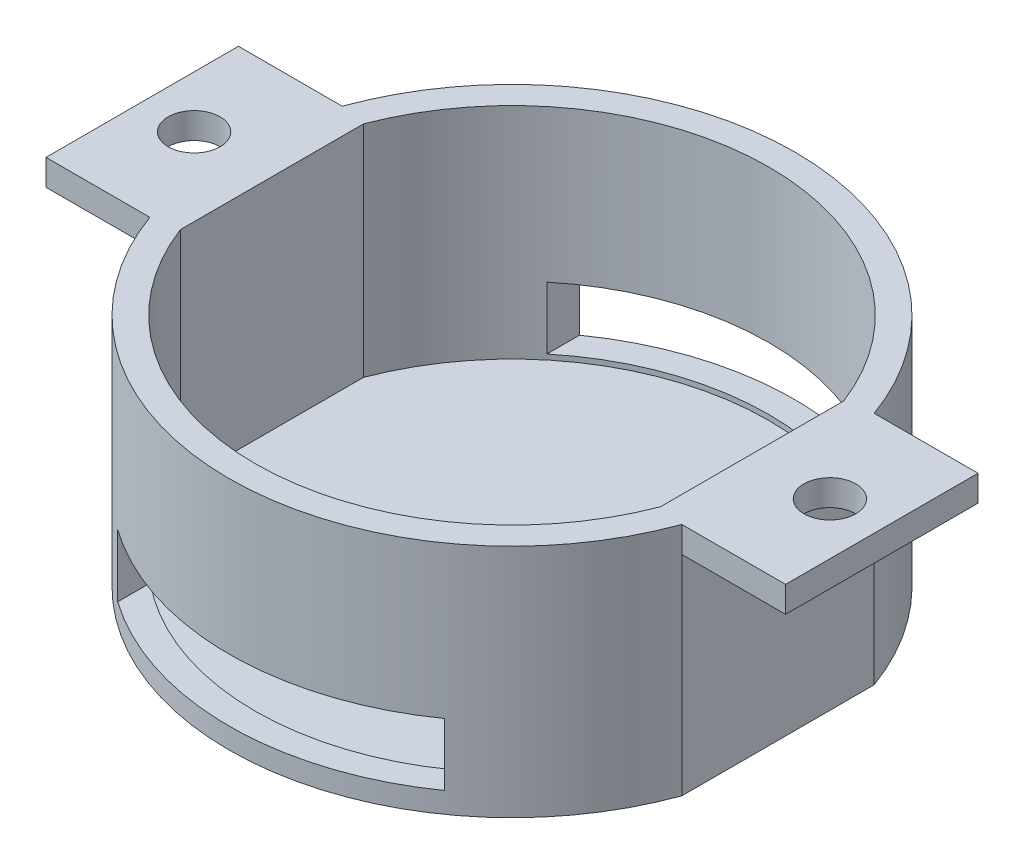
ISO-10303-21;
HEADER;
FILE_DESCRIPTION(('STEP AP214'),'2;1');
FILE_NAME('part.step','',(''),(''),'','','');
FILE_SCHEMA(('AUTOMOTIVE_DESIGN { 1 0 10303 214 1 1 1 1 }'));
ENDSEC;
DATA;
#1=APPLICATION_CONTEXT('core data for automotive mechanical design processes');
#2=APPLICATION_PROTOCOL_DEFINITION('international standard','automotive_design',2000,#1);
#3=PRODUCT_CONTEXT('',#1,'mechanical');
#4=PRODUCT('Part','Part','',(#3));
#5=PRODUCT_RELATED_PRODUCT_CATEGORY('part','',(#4));
#6=PRODUCT_DEFINITION_FORMATION('','',#4);
#7=PRODUCT_DEFINITION_CONTEXT('part definition',#1,'design');
#8=PRODUCT_DEFINITION('design','',#6,#7);
#9=PRODUCT_DEFINITION_SHAPE('','',#8);
#10=(LENGTH_UNIT() NAMED_UNIT(*) SI_UNIT(.MILLI.,.METRE.));
#11=(NAMED_UNIT(*) PLANE_ANGLE_UNIT() SI_UNIT($,.RADIAN.));
#12=(NAMED_UNIT(*) SI_UNIT($,.STERADIAN.) SOLID_ANGLE_UNIT());
#13=UNCERTAINTY_MEASURE_WITH_UNIT(LENGTH_MEASURE(1.E-05),#10,'distance_accuracy_value','');
#14=(GEOMETRIC_REPRESENTATION_CONTEXT(3) GLOBAL_UNCERTAINTY_ASSIGNED_CONTEXT((#13)) GLOBAL_UNIT_ASSIGNED_CONTEXT((#10,
#11,#12)) REPRESENTATION_CONTEXT('',''));
#15=CARTESIAN_POINT('',(0.,0.,0.));
#16=DIRECTION('',(0.,0.,1.));
#17=DIRECTION('',(1.,0.,0.));
#18=AXIS2_PLACEMENT_3D('',#15,#16,#17);
#19=CARTESIAN_POINT('',(51.25,42.3,-18.5388106414624));
#20=DIRECTION('',(-1.,0.,0.));
#21=DIRECTION('',(0.,0.,1.));
#22=AXIS2_PLACEMENT_3D('',#19,#20,#21);
#23=PLANE('',#22);
#24=DIRECTION('',(0.,0.,-1.));
#25=VECTOR('',#24,1.);
#26=CARTESIAN_POINT('',(51.25,37.3,18.5388106414624));
#27=LINE('',#26,#25);
#28=CARTESIAN_POINT('',(51.25,37.3,18.5388106414624));
#29=VERTEX_POINT('',#28);
#30=CARTESIAN_POINT('',(51.25,37.3,-18.5388106414624));
#31=VERTEX_POINT('',#30);
#32=EDGE_CURVE('E309',#29,#31,#27,.T.);
#33=ORIENTED_EDGE('',*,*,#32,.F.);
#34=DIRECTION('',(0.,-1.,0.));
#35=VECTOR('',#34,1.);
#36=CARTESIAN_POINT('',(51.25,42.3,18.5388106414624));
#37=LINE('',#36,#35);
#38=CARTESIAN_POINT('',(51.25,-3.,18.5388106414625));
#39=VERTEX_POINT('',#38);
#40=EDGE_CURVE('E224',#29,#39,#37,.T.);
#41=ORIENTED_EDGE('',*,*,#40,.T.);
#42=DIRECTION('',(0.,0.,1.));
#43=VECTOR('',#42,1.);
#44=CARTESIAN_POINT('',(51.25,-3.,0.));
#45=LINE('',#44,#43);
#46=CARTESIAN_POINT('',(51.25,-3.,-18.5388106414624));
#47=VERTEX_POINT('',#46);
#48=EDGE_CURVE('E269',#47,#39,#45,.T.);
#49=ORIENTED_EDGE('',*,*,#48,.F.);
#50=DIRECTION('',(0.,-1.,0.));
#51=VECTOR('',#50,1.);
#52=CARTESIAN_POINT('',(51.25,42.3,-18.5388106414624));
#53=LINE('',#52,#51);
#54=EDGE_CURVE('E227',#31,#47,#53,.T.);
#55=ORIENTED_EDGE('',*,*,#54,.F.);
#56=EDGE_LOOP('',(#33,#41,#49,#55));
#57=FACE_BOUND('',#56,.T.);
#58=ADVANCED_FACE('F43',(#57),#23,.F.);
#59=CARTESIAN_POINT('',(-51.25,42.3,-18.5388106414624));
#60=DIRECTION('',(1.,0.,0.));
#61=DIRECTION('',(0.,0.,-1.));
#62=AXIS2_PLACEMENT_3D('',#59,#60,#61);
#63=PLANE('',#62);
#64=DIRECTION('',(0.,0.,1.));
#65=VECTOR('',#64,1.);
#66=CARTESIAN_POINT('',(-51.25,37.3,-18.5388106414624));
#67=LINE('',#66,#65);
#68=CARTESIAN_POINT('',(-51.25,37.3,-18.5388106414624));
#69=VERTEX_POINT('',#68);
#70=CARTESIAN_POINT('',(-51.25,37.3,18.5388106414624));
#71=VERTEX_POINT('',#70);
#72=EDGE_CURVE('E285',#69,#71,#67,.T.);
#73=ORIENTED_EDGE('',*,*,#72,.F.);
#74=DIRECTION('',(0.,-1.,0.));
#75=VECTOR('',#74,1.);
#76=CARTESIAN_POINT('',(-51.25,42.3,-18.5388106414624));
#77=LINE('',#76,#75);
#78=CARTESIAN_POINT('',(-51.25,-3.,-18.5388106414625));
#79=VERTEX_POINT('',#78);
#80=EDGE_CURVE('E217',#69,#79,#77,.T.);
#81=ORIENTED_EDGE('',*,*,#80,.T.);
#82=DIRECTION('',(0.,0.,1.));
#83=VECTOR('',#82,1.);
#84=CARTESIAN_POINT('',(-51.25,-3.,0.));
#85=LINE('',#84,#83);
#86=CARTESIAN_POINT('',(-51.25,-3.,18.5388106414624));
#87=VERTEX_POINT('',#86);
#88=EDGE_CURVE('E263',#79,#87,#85,.T.);
#89=ORIENTED_EDGE('',*,*,#88,.T.);
#90=DIRECTION('',(0.,-1.,0.));
#91=VECTOR('',#90,1.);
#92=CARTESIAN_POINT('',(-51.25,42.3,18.5388106414624));
#93=LINE('',#92,#91);
#94=EDGE_CURVE('E220',#71,#87,#93,.T.);
#95=ORIENTED_EDGE('',*,*,#94,.F.);
#96=EDGE_LOOP('',(#73,#81,#89,#95));
#97=FACE_BOUND('',#96,.T.);
#98=ADVANCED_FACE('F393',(#97),#63,.F.);
#99=CARTESIAN_POINT('',(0.,42.3,0.));
#100=DIRECTION('',(0.,1.,0.));
#101=DIRECTION('',(0.,0.,1.));
#102=AXIS2_PLACEMENT_3D('',#99,#100,#101);
#103=PLANE('',#102);
#104=CARTESIAN_POINT('',(61.25,42.3,0.));
#105=DIRECTION('',(0.,1.,0.));
#106=DIRECTION('',(0.,0.,1.));
#107=AXIS2_PLACEMENT_3D('',#104,#105,#106);
#108=CIRCLE('',#107,5.);
#109=CARTESIAN_POINT('',(61.25,42.3,5.));
#110=VERTEX_POINT('',#109);
#111=EDGE_CURVE('E329',#110,#110,#108,.T.);
#112=ORIENTED_EDGE('',*,*,#111,.F.);
#113=EDGE_LOOP('',(#112));
#114=FACE_BOUND('',#113,.T.);
#115=CARTESIAN_POINT('',(-61.25,42.3,0.));
#116=DIRECTION('',(0.,1.,0.));
#117=DIRECTION('',(0.,0.,1.));
#118=AXIS2_PLACEMENT_3D('',#115,#116,#117);
#119=CIRCLE('',#118,5.);
#120=CARTESIAN_POINT('',(-61.25,42.3,5.));
#121=VERTEX_POINT('',#120);
#122=EDGE_CURVE('E323',#121,#121,#119,.T.);
#123=ORIENTED_EDGE('',*,*,#122,.F.);
#124=EDGE_LOOP('',(#123));
#125=FACE_BOUND('',#124,.T.);
#126=CARTESIAN_POINT('',(0.,42.3,0.));
#127=DIRECTION('',(0.,1.,0.));
#128=DIRECTION('',(0.,0.,1.));
#129=AXIS2_PLACEMENT_3D('',#126,#127,#128);
#130=CIRCLE('',#129,54.5);
#131=CARTESIAN_POINT('',(51.25,42.3,-18.5388106414624));
#132=VERTEX_POINT('',#131);
#133=CARTESIAN_POINT('',(-51.25,42.3,-18.5388106414624));
#134=VERTEX_POINT('',#133);
#135=EDGE_CURVE('E230',#132,#134,#130,.T.);
#136=ORIENTED_EDGE('',*,*,#135,.T.);
#137=DIRECTION('',(1.,0.,0.));
#138=VECTOR('',#137,1.);
#139=CARTESIAN_POINT('',(-71.25,42.3,-18.5388106414624));
#140=LINE('',#139,#138);
#141=CARTESIAN_POINT('',(-71.25,42.3,-18.5388106414624));
#142=VERTEX_POINT('',#141);
#143=EDGE_CURVE('E281',#142,#134,#140,.T.);
#144=ORIENTED_EDGE('',*,*,#143,.F.);
#145=DIRECTION('',(0.,0.,-1.));
#146=VECTOR('',#145,1.);
#147=CARTESIAN_POINT('',(-71.25,42.3,-18.5388106414624));
#148=LINE('',#147,#146);
#149=CARTESIAN_POINT('',(-71.25,42.3,18.5388106414624));
#150=VERTEX_POINT('',#149);
#151=EDGE_CURVE('E284',#150,#142,#148,.T.);
#152=ORIENTED_EDGE('',*,*,#151,.F.);
#153=DIRECTION('',(1.,0.,0.));
#154=VECTOR('',#153,1.);
#155=CARTESIAN_POINT('',(-71.25,42.3,18.5388106414624));
#156=LINE('',#155,#154);
#157=CARTESIAN_POINT('',(-51.25,42.3,18.5388106414624));
#158=VERTEX_POINT('',#157);
#159=EDGE_CURVE('E278',#150,#158,#156,.T.);
#160=ORIENTED_EDGE('',*,*,#159,.T.);
#161=CARTESIAN_POINT('',(0.,42.3,0.));
#162=DIRECTION('',(0.,1.,0.));
#163=DIRECTION('',(0.,0.,1.));
#164=AXIS2_PLACEMENT_3D('',#161,#162,#163);
#165=CIRCLE('',#164,54.5);
#166=CARTESIAN_POINT('',(51.25,42.3,18.5388106414624));
#167=VERTEX_POINT('',#166);
#168=EDGE_CURVE('E228',#158,#167,#165,.T.);
#169=ORIENTED_EDGE('',*,*,#168,.T.);
#170=DIRECTION('',(-1.,0.,0.));
#171=VECTOR('',#170,1.);
#172=CARTESIAN_POINT('',(71.25,42.3,18.5388106414624));
#173=LINE('',#172,#171);
#174=CARTESIAN_POINT('',(71.25,42.3,18.5388106414624));
#175=VERTEX_POINT('',#174);
#176=EDGE_CURVE('E305',#175,#167,#173,.T.);
#177=ORIENTED_EDGE('',*,*,#176,.F.);
#178=DIRECTION('',(0.,0.,1.));
#179=VECTOR('',#178,1.);
#180=CARTESIAN_POINT('',(71.25,42.3,18.5388106414624));
#181=LINE('',#180,#179);
#182=CARTESIAN_POINT('',(71.25,42.3,-18.5388106414624));
#183=VERTEX_POINT('',#182);
#184=EDGE_CURVE('E308',#183,#175,#181,.T.);
#185=ORIENTED_EDGE('',*,*,#184,.F.);
#186=DIRECTION('',(-1.,0.,0.));
#187=VECTOR('',#186,1.);
#188=CARTESIAN_POINT('',(71.25,42.3,-18.5388106414624));
#189=LINE('',#188,#187);
#190=EDGE_CURVE('E302',#183,#132,#189,.T.);
#191=ORIENTED_EDGE('',*,*,#190,.T.);
#192=EDGE_LOOP('',(#136,#144,#152,#160,#169,#177,#185,#191));
#193=FACE_BOUND('',#192,.T.);
#194=DIRECTION('',(0.,0.,1.));
#195=VECTOR('',#194,1.);
#196=CARTESIAN_POINT('',(-46.25,42.3,-17.6405073623181));
#197=LINE('',#196,#195);
#198=CARTESIAN_POINT('',(-46.25,42.3,-17.6405073623181));
#199=VERTEX_POINT('',#198);
#200=CARTESIAN_POINT('',(-46.25,42.3,17.6405073623181));
#201=VERTEX_POINT('',#200);
#202=EDGE_CURVE('E260',#199,#201,#197,.T.);
#203=ORIENTED_EDGE('',*,*,#202,.F.);
#204=CARTESIAN_POINT('',(0.,42.3,0.));
#205=DIRECTION('',(0.,1.,0.));
#206=DIRECTION('',(0.,0.,1.));
#207=AXIS2_PLACEMENT_3D('',#204,#205,#206);
#208=CIRCLE('',#207,49.5);
#209=CARTESIAN_POINT('',(46.25,42.3,-17.6405073623181));
#210=VERTEX_POINT('',#209);
#211=EDGE_CURVE('E245',#210,#199,#208,.T.);
#212=ORIENTED_EDGE('',*,*,#211,.F.);
#213=DIRECTION('',(0.,0.,-1.));
#214=VECTOR('',#213,1.);
#215=CARTESIAN_POINT('',(46.25,42.3,-17.6405073623181));
#216=LINE('',#215,#214);
#217=CARTESIAN_POINT('',(46.25,42.3,17.6405073623182));
#218=VERTEX_POINT('',#217);
#219=EDGE_CURVE('E241',#218,#210,#216,.T.);
#220=ORIENTED_EDGE('',*,*,#219,.F.);
#221=CARTESIAN_POINT('',(0.,42.3,0.));
#222=DIRECTION('',(0.,1.,0.));
#223=DIRECTION('',(0.,0.,1.));
#224=AXIS2_PLACEMENT_3D('',#221,#222,#223);
#225=CIRCLE('',#224,49.5);
#226=EDGE_CURVE('E257',#201,#218,#225,.T.);
#227=ORIENTED_EDGE('',*,*,#226,.F.);
#228=EDGE_LOOP('',(#203,#212,#220,#227));
#229=FACE_BOUND('',#228,.T.);
#230=ADVANCED_FACE('F399',(#114,#125,#193,#229),#103,.T.);
#231=CARTESIAN_POINT('',(0.,42.3,0.));
#232=DIRECTION('',(0.,-1.,0.));
#233=DIRECTION('',(0.,0.,-1.));
#234=AXIS2_PLACEMENT_3D('',#231,#232,#233);
#235=CYLINDRICAL_SURFACE('',#234,54.5);
#236=DIRECTION('',(0.,-1.,0.));
#237=VECTOR('',#236,1.);
#238=CARTESIAN_POINT('',(-31.477498370648,42.3,-44.4906405474888));
#239=LINE('',#238,#237);
#240=CARTESIAN_POINT('',(-31.477498370648,13.,-44.4906405474888));
#241=VERTEX_POINT('',#240);
#242=CARTESIAN_POINT('',(-31.477498370648,1.,-44.4906405474888));
#243=VERTEX_POINT('',#242);
#244=EDGE_CURVE('E354',#241,#243,#239,.T.);
#245=ORIENTED_EDGE('',*,*,#244,.T.);
#246=CARTESIAN_POINT('',(0.,0.999999999999994,0.));
#247=DIRECTION('',(0.,-1.,0.));
#248=DIRECTION('',(1.,0.,0.));
#249=AXIS2_PLACEMENT_3D('',#246,#247,#248);
#250=CIRCLE('',#249,54.5);
#251=CARTESIAN_POINT('',(31.477498370648,0.999999999999992,-44.4906405474888));
#252=VERTEX_POINT('',#251);
#253=EDGE_CURVE('E332',#243,#252,#250,.T.);
#254=ORIENTED_EDGE('',*,*,#253,.T.);
#255=DIRECTION('',(0.,-1.,0.));
#256=VECTOR('',#255,1.);
#257=CARTESIAN_POINT('',(31.477498370648,42.3,-44.4906405474888));
#258=LINE('',#257,#256);
#259=CARTESIAN_POINT('',(31.477498370648,13.,-44.4906405474888));
#260=VERTEX_POINT('',#259);
#261=EDGE_CURVE('E339',#252,#260,#258,.F.);
#262=ORIENTED_EDGE('',*,*,#261,.T.);
#263=CARTESIAN_POINT('',(0.,13.,0.));
#264=DIRECTION('',(0.,1.,0.));
#265=DIRECTION('',(-1.,0.,0.));
#266=AXIS2_PLACEMENT_3D('',#263,#264,#265);
#267=CIRCLE('',#266,54.5);
#268=EDGE_CURVE('E347',#260,#241,#267,.T.);
#269=ORIENTED_EDGE('',*,*,#268,.T.);
#270=EDGE_LOOP('',(#245,#254,#262,#269));
#271=FACE_BOUND('',#270,.T.);
#272=EDGE_CURVE('E225',#132,#31,#53,.T.);
#273=ORIENTED_EDGE('',*,*,#272,.T.);
#274=ORIENTED_EDGE('',*,*,#54,.T.);
#275=CARTESIAN_POINT('',(0.,-3.,0.));
#276=DIRECTION('',(0.,-1.,0.));
#277=DIRECTION('',(0.,0.,-1.));
#278=AXIS2_PLACEMENT_3D('',#275,#276,#277);
#279=CIRCLE('',#278,54.5);
#280=EDGE_CURVE('E255',#79,#47,#279,.T.);
#281=ORIENTED_EDGE('',*,*,#280,.F.);
#282=ORIENTED_EDGE('',*,*,#80,.F.);
#283=EDGE_CURVE('E199',#134,#69,#77,.T.);
#284=ORIENTED_EDGE('',*,*,#283,.F.);
#285=ORIENTED_EDGE('',*,*,#135,.F.);
#286=EDGE_LOOP('',(#273,#274,#281,#282,#284,#285));
#287=FACE_BOUND('',#286,.T.);
#288=ADVANCED_FACE('F45',(#271,#287),#235,.T.);
#289=CARTESIAN_POINT('',(0.,42.3,0.));
#290=DIRECTION('',(0.,-1.,0.));
#291=DIRECTION('',(0.,0.,-1.));
#292=AXIS2_PLACEMENT_3D('',#289,#290,#291);
#293=CYLINDRICAL_SURFACE('',#292,54.5);
#294=DIRECTION('',(0.,-1.,0.));
#295=VECTOR('',#294,1.);
#296=CARTESIAN_POINT('',(-31.477498370648,42.3,44.4906405474888));
#297=LINE('',#296,#295);
#298=CARTESIAN_POINT('',(-31.477498370648,1.,44.4906405474888));
#299=VERTEX_POINT('',#298);
#300=CARTESIAN_POINT('',(-31.477498370648,13.,44.4906405474888));
#301=VERTEX_POINT('',#300);
#302=EDGE_CURVE('E357',#299,#301,#297,.F.);
#303=ORIENTED_EDGE('',*,*,#302,.T.);
#304=CARTESIAN_POINT('',(0.,13.,0.));
#305=DIRECTION('',(0.,1.,0.));
#306=DIRECTION('',(-1.,0.,0.));
#307=AXIS2_PLACEMENT_3D('',#304,#305,#306);
#308=CIRCLE('',#307,54.5);
#309=CARTESIAN_POINT('',(31.477498370648,13.,44.4906405474888));
#310=VERTEX_POINT('',#309);
#311=EDGE_CURVE('E205',#301,#310,#308,.T.);
#312=ORIENTED_EDGE('',*,*,#311,.T.);
#313=DIRECTION('',(0.,-1.,0.));
#314=VECTOR('',#313,1.);
#315=CARTESIAN_POINT('',(31.477498370648,42.3,44.4906405474888));
#316=LINE('',#315,#314);
#317=CARTESIAN_POINT('',(31.477498370648,0.999999999999992,44.4906405474888));
#318=VERTEX_POINT('',#317);
#319=EDGE_CURVE('E342',#310,#318,#316,.T.);
#320=ORIENTED_EDGE('',*,*,#319,.T.);
#321=CARTESIAN_POINT('',(0.,0.999999999999994,0.));
#322=DIRECTION('',(0.,-1.,0.));
#323=DIRECTION('',(1.,0.,0.));
#324=AXIS2_PLACEMENT_3D('',#321,#322,#323);
#325=CIRCLE('',#324,54.5);
#326=EDGE_CURVE('E335',#318,#299,#325,.T.);
#327=ORIENTED_EDGE('',*,*,#326,.T.);
#328=EDGE_LOOP('',(#303,#312,#320,#327));
#329=FACE_BOUND('',#328,.T.);
#330=EDGE_CURVE('E218',#158,#71,#93,.T.);
#331=ORIENTED_EDGE('',*,*,#330,.T.);
#332=ORIENTED_EDGE('',*,*,#94,.T.);
#333=EDGE_CURVE('E266',#39,#87,#279,.T.);
#334=ORIENTED_EDGE('',*,*,#333,.F.);
#335=ORIENTED_EDGE('',*,*,#40,.F.);
#336=EDGE_CURVE('E221',#167,#29,#37,.T.);
#337=ORIENTED_EDGE('',*,*,#336,.F.);
#338=ORIENTED_EDGE('',*,*,#168,.F.);
#339=EDGE_LOOP('',(#331,#332,#334,#335,#337,#338));
#340=FACE_BOUND('',#339,.T.);
#341=ADVANCED_FACE('F377',(#329,#340),#293,.T.);
#342=CARTESIAN_POINT('',(0.,42.3,0.));
#343=DIRECTION('',(0.,-1.,0.));
#344=DIRECTION('',(0.,0.,-1.));
#345=AXIS2_PLACEMENT_3D('',#342,#343,#344);
#346=CYLINDRICAL_SURFACE('',#345,49.5);
#347=CARTESIAN_POINT('',(0.,0.999999999999994,0.));
#348=DIRECTION('',(0.,-1.,0.));
#349=DIRECTION('',(1.,0.,0.));
#350=AXIS2_PLACEMENT_3D('',#347,#348,#349);
#351=CIRCLE('',#350,49.5);
#352=CARTESIAN_POINT('',(-31.477498370648,1.,-38.2023179444109));
#353=VERTEX_POINT('',#352);
#354=CARTESIAN_POINT('',(31.477498370648,0.999999999999992,-38.2023179444109));
#355=VERTEX_POINT('',#354);
#356=EDGE_CURVE('E337',#353,#355,#351,.T.);
#357=ORIENTED_EDGE('',*,*,#356,.F.);
#358=DIRECTION('',(0.,-1.,0.));
#359=VECTOR('',#358,1.);
#360=CARTESIAN_POINT('',(-31.477498370648,42.3,-38.2023179444109));
#361=LINE('',#360,#359);
#362=CARTESIAN_POINT('',(-31.477498370648,13.,-38.2023179444109));
#363=VERTEX_POINT('',#362);
#364=EDGE_CURVE('E359',#363,#353,#361,.T.);
#365=ORIENTED_EDGE('',*,*,#364,.F.);
#366=CARTESIAN_POINT('',(0.,13.,0.));
#367=DIRECTION('',(0.,1.,0.));
#368=DIRECTION('',(-1.,0.,0.));
#369=AXIS2_PLACEMENT_3D('',#366,#367,#368);
#370=CIRCLE('',#369,49.5);
#371=CARTESIAN_POINT('',(31.477498370648,13.,-38.2023179444109));
#372=VERTEX_POINT('',#371);
#373=EDGE_CURVE('E351',#372,#363,#370,.T.);
#374=ORIENTED_EDGE('',*,*,#373,.F.);
#375=DIRECTION('',(0.,-1.,0.));
#376=VECTOR('',#375,1.);
#377=CARTESIAN_POINT('',(31.477498370648,42.3,-38.2023179444109));
#378=LINE('',#377,#376);
#379=EDGE_CURVE('E345',#355,#372,#378,.F.);
#380=ORIENTED_EDGE('',*,*,#379,.F.);
#381=EDGE_LOOP('',(#357,#365,#374,#380));
#382=FACE_BOUND('',#381,.T.);
#383=CARTESIAN_POINT('',(0.,0.,0.));
#384=DIRECTION('',(0.,1.,0.));
#385=DIRECTION('',(0.,0.,1.));
#386=AXIS2_PLACEMENT_3D('',#383,#384,#385);
#387=CIRCLE('',#386,49.5);
#388=CARTESIAN_POINT('',(46.25,0.,-17.6405073623181));
#389=VERTEX_POINT('',#388);
#390=CARTESIAN_POINT('',(-46.25,0.,-17.6405073623181));
#391=VERTEX_POINT('',#390);
#392=EDGE_CURVE('E252',#389,#391,#387,.T.);
#393=ORIENTED_EDGE('',*,*,#392,.F.);
#394=DIRECTION('',(0.,-1.,0.));
#395=VECTOR('',#394,1.);
#396=CARTESIAN_POINT('',(46.25,42.3,-17.6405073623181));
#397=LINE('',#396,#395);
#398=EDGE_CURVE('E239',#210,#389,#397,.T.);
#399=ORIENTED_EDGE('',*,*,#398,.F.);
#400=ORIENTED_EDGE('',*,*,#211,.T.);
#401=DIRECTION('',(0.,-1.,0.));
#402=VECTOR('',#401,1.);
#403=CARTESIAN_POINT('',(-46.25,42.3,-17.6405073623181));
#404=LINE('',#403,#402);
#405=EDGE_CURVE('E232',#199,#391,#404,.T.);
#406=ORIENTED_EDGE('',*,*,#405,.T.);
#407=EDGE_LOOP('',(#393,#399,#400,#406));
#408=FACE_BOUND('',#407,.T.);
#409=ADVANCED_FACE('F405',(#382,#408),#346,.F.);
#410=CARTESIAN_POINT('',(-46.25,42.3,-17.6405073623181));
#411=DIRECTION('',(1.,0.,0.));
#412=DIRECTION('',(0.,0.,-1.));
#413=AXIS2_PLACEMENT_3D('',#410,#411,#412);
#414=PLANE('',#413);
#415=DIRECTION('',(0.,0.,1.));
#416=VECTOR('',#415,1.);
#417=CARTESIAN_POINT('',(-46.25,0.,-17.6405073623181));
#418=LINE('',#417,#416);
#419=CARTESIAN_POINT('',(-46.25,0.,17.6405073623181));
#420=VERTEX_POINT('',#419);
#421=EDGE_CURVE('E249',#391,#420,#418,.T.);
#422=ORIENTED_EDGE('',*,*,#421,.F.);
#423=ORIENTED_EDGE('',*,*,#405,.F.);
#424=ORIENTED_EDGE('',*,*,#202,.T.);
#425=DIRECTION('',(0.,-1.,0.));
#426=VECTOR('',#425,1.);
#427=CARTESIAN_POINT('',(-46.25,42.3,17.6405073623181));
#428=LINE('',#427,#426);
#429=EDGE_CURVE('E235',#201,#420,#428,.T.);
#430=ORIENTED_EDGE('',*,*,#429,.T.);
#431=EDGE_LOOP('',(#422,#423,#424,#430));
#432=FACE_BOUND('',#431,.T.);
#433=ADVANCED_FACE('F410',(#432),#414,.T.);
#434=CARTESIAN_POINT('',(0.,42.3,0.));
#435=DIRECTION('',(0.,-1.,0.));
#436=DIRECTION('',(0.,0.,-1.));
#437=AXIS2_PLACEMENT_3D('',#434,#435,#436);
#438=CYLINDRICAL_SURFACE('',#437,49.5);
#439=CARTESIAN_POINT('',(0.,0.999999999999994,0.));
#440=DIRECTION('',(0.,-1.,0.));
#441=DIRECTION('',(1.,0.,0.));
#442=AXIS2_PLACEMENT_3D('',#439,#440,#441);
#443=CIRCLE('',#442,49.5);
#444=CARTESIAN_POINT('',(31.477498370648,0.999999999999992,38.2023179444109));
#445=VERTEX_POINT('',#444);
#446=CARTESIAN_POINT('',(-31.477498370648,1.,38.2023179444109));
#447=VERTEX_POINT('',#446);
#448=EDGE_CURVE('E11',#445,#447,#443,.T.);
#449=ORIENTED_EDGE('',*,*,#448,.F.);
#450=DIRECTION('',(0.,-1.,0.));
#451=VECTOR('',#450,1.);
#452=CARTESIAN_POINT('',(31.477498370648,42.3,38.2023179444109));
#453=LINE('',#452,#451);
#454=CARTESIAN_POINT('',(31.477498370648,13.,38.2023179444109));
#455=VERTEX_POINT('',#454);
#456=EDGE_CURVE('E51',#455,#445,#453,.T.);
#457=ORIENTED_EDGE('',*,*,#456,.F.);
#458=CARTESIAN_POINT('',(0.,13.,0.));
#459=DIRECTION('',(0.,1.,0.));
#460=DIRECTION('',(-1.,0.,0.));
#461=AXIS2_PLACEMENT_3D('',#458,#459,#460);
#462=CIRCLE('',#461,49.5);
#463=CARTESIAN_POINT('',(-31.477498370648,13.,38.2023179444109));
#464=VERTEX_POINT('',#463);
#465=EDGE_CURVE('E198',#464,#455,#462,.T.);
#466=ORIENTED_EDGE('',*,*,#465,.F.);
#467=DIRECTION('',(0.,-1.,0.));
#468=VECTOR('',#467,1.);
#469=CARTESIAN_POINT('',(-31.477498370648,42.3,38.2023179444109));
#470=LINE('',#469,#468);
#471=EDGE_CURVE('E191',#447,#464,#470,.F.);
#472=ORIENTED_EDGE('',*,*,#471,.F.);
#473=EDGE_LOOP('',(#449,#457,#466,#472));
#474=FACE_BOUND('',#473,.T.);
#475=CARTESIAN_POINT('',(0.,0.,0.));
#476=DIRECTION('',(0.,1.,0.));
#477=DIRECTION('',(0.,0.,1.));
#478=AXIS2_PLACEMENT_3D('',#475,#476,#477);
#479=CIRCLE('',#478,49.5);
#480=CARTESIAN_POINT('',(46.25,0.,17.6405073623182));
#481=VERTEX_POINT('',#480);
#482=EDGE_CURVE('E246',#420,#481,#479,.T.);
#483=ORIENTED_EDGE('',*,*,#482,.F.);
#484=ORIENTED_EDGE('',*,*,#429,.F.);
#485=ORIENTED_EDGE('',*,*,#226,.T.);
#486=DIRECTION('',(0.,-1.,0.));
#487=VECTOR('',#486,1.);
#488=CARTESIAN_POINT('',(46.25,42.3,17.6405073623182));
#489=LINE('',#488,#487);
#490=EDGE_CURVE('E237',#218,#481,#489,.T.);
#491=ORIENTED_EDGE('',*,*,#490,.T.);
#492=EDGE_LOOP('',(#483,#484,#485,#491));
#493=FACE_BOUND('',#492,.T.);
#494=ADVANCED_FACE('F211',(#474,#493),#438,.F.);
#495=CARTESIAN_POINT('',(46.25,42.3,-17.6405073623181));
#496=DIRECTION('',(-1.,0.,0.));
#497=DIRECTION('',(0.,0.,1.));
#498=AXIS2_PLACEMENT_3D('',#495,#496,#497);
#499=PLANE('',#498);
#500=DIRECTION('',(0.,0.,-1.));
#501=VECTOR('',#500,1.);
#502=CARTESIAN_POINT('',(46.25,0.,-17.6405073623181));
#503=LINE('',#502,#501);
#504=EDGE_CURVE('E242',#481,#389,#503,.T.);
#505=ORIENTED_EDGE('',*,*,#504,.F.);
#506=ORIENTED_EDGE('',*,*,#490,.F.);
#507=ORIENTED_EDGE('',*,*,#219,.T.);
#508=ORIENTED_EDGE('',*,*,#398,.T.);
#509=EDGE_LOOP('',(#505,#506,#507,#508));
#510=FACE_BOUND('',#509,.T.);
#511=ADVANCED_FACE('F486',(#510),#499,.T.);
#512=CARTESIAN_POINT('',(0.,0.,0.));
#513=DIRECTION('',(0.,-1.,0.));
#514=DIRECTION('',(0.,0.,-1.));
#515=AXIS2_PLACEMENT_3D('',#512,#513,#514);
#516=PLANE('',#515);
#517=ORIENTED_EDGE('',*,*,#504,.T.);
#518=ORIENTED_EDGE('',*,*,#392,.T.);
#519=ORIENTED_EDGE('',*,*,#421,.T.);
#520=ORIENTED_EDGE('',*,*,#482,.T.);
#521=EDGE_LOOP('',(#517,#518,#519,#520));
#522=FACE_BOUND('',#521,.T.);
#523=ADVANCED_FACE('F483',(#522),#516,.F.);
#524=CARTESIAN_POINT('',(0.,-3.,0.));
#525=DIRECTION('',(0.,-1.,0.));
#526=DIRECTION('',(0.,0.,-1.));
#527=AXIS2_PLACEMENT_3D('',#524,#525,#526);
#528=PLANE('',#527);
#529=ORIENTED_EDGE('',*,*,#48,.T.);
#530=ORIENTED_EDGE('',*,*,#333,.T.);
#531=ORIENTED_EDGE('',*,*,#88,.F.);
#532=ORIENTED_EDGE('',*,*,#280,.T.);
#533=EDGE_LOOP('',(#529,#530,#531,#532));
#534=FACE_BOUND('',#533,.T.);
#535=ADVANCED_FACE('F447',(#534),#528,.T.);
#536=CARTESIAN_POINT('',(-71.25,42.3,-18.5388106414624));
#537=DIRECTION('',(0.,0.,1.));
#538=DIRECTION('',(1.,0.,0.));
#539=AXIS2_PLACEMENT_3D('',#536,#537,#538);
#540=PLANE('',#539);
#541=ORIENTED_EDGE('',*,*,#283,.T.);
#542=DIRECTION('',(1.,0.,0.));
#543=VECTOR('',#542,1.);
#544=CARTESIAN_POINT('',(-71.25,37.3,-18.5388106414624));
#545=LINE('',#544,#543);
#546=CARTESIAN_POINT('',(-71.25,37.3,-18.5388106414624));
#547=VERTEX_POINT('',#546);
#548=EDGE_CURVE('E272',#547,#69,#545,.T.);
#549=ORIENTED_EDGE('',*,*,#548,.F.);
#550=DIRECTION('',(0.,-1.,0.));
#551=VECTOR('',#550,1.);
#552=CARTESIAN_POINT('',(-71.25,42.3,-18.5388106414624));
#553=LINE('',#552,#551);
#554=EDGE_CURVE('E288',#142,#547,#553,.T.);
#555=ORIENTED_EDGE('',*,*,#554,.F.);
#556=ORIENTED_EDGE('',*,*,#143,.T.);
#557=EDGE_LOOP('',(#541,#549,#555,#556));
#558=FACE_BOUND('',#557,.T.);
#559=ADVANCED_FACE('F455',(#558),#540,.F.);
#560=CARTESIAN_POINT('',(-71.25,37.3,-18.5388106414624));
#561=DIRECTION('',(0.,1.,0.));
#562=DIRECTION('',(0.,0.,1.));
#563=AXIS2_PLACEMENT_3D('',#560,#561,#562);
#564=PLANE('',#563);
#565=CARTESIAN_POINT('',(-61.25,37.3,0.));
#566=DIRECTION('',(0.,1.,0.));
#567=DIRECTION('',(0.,0.,1.));
#568=AXIS2_PLACEMENT_3D('',#565,#566,#567);
#569=CIRCLE('',#568,5.);
#570=CARTESIAN_POINT('',(-61.25,37.3,5.));
#571=VERTEX_POINT('',#570);
#572=EDGE_CURVE('E313',#571,#571,#569,.F.);
#573=ORIENTED_EDGE('',*,*,#572,.F.);
#574=EDGE_LOOP('',(#573));
#575=FACE_BOUND('',#574,.T.);
#576=ORIENTED_EDGE('',*,*,#72,.T.);
#577=DIRECTION('',(1.,0.,0.));
#578=VECTOR('',#577,1.);
#579=CARTESIAN_POINT('',(-71.25,37.3,18.5388106414624));
#580=LINE('',#579,#578);
#581=CARTESIAN_POINT('',(-71.25,37.3,18.5388106414624));
#582=VERTEX_POINT('',#581);
#583=EDGE_CURVE('E275',#582,#71,#580,.T.);
#584=ORIENTED_EDGE('',*,*,#583,.F.);
#585=DIRECTION('',(0.,0.,1.));
#586=VECTOR('',#585,1.);
#587=CARTESIAN_POINT('',(-71.25,37.3,-18.5388106414624));
#588=LINE('',#587,#586);
#589=EDGE_CURVE('E293',#547,#582,#588,.T.);
#590=ORIENTED_EDGE('',*,*,#589,.F.);
#591=ORIENTED_EDGE('',*,*,#548,.T.);
#592=EDGE_LOOP('',(#576,#584,#590,#591));
#593=FACE_BOUND('',#592,.T.);
#594=ADVANCED_FACE('F451',(#575,#593),#564,.F.);
#595=CARTESIAN_POINT('',(-71.25,42.3,18.5388106414624));
#596=DIRECTION('',(0.,0.,-1.));
#597=DIRECTION('',(-1.,0.,0.));
#598=AXIS2_PLACEMENT_3D('',#595,#596,#597);
#599=PLANE('',#598);
#600=ORIENTED_EDGE('',*,*,#330,.F.);
#601=ORIENTED_EDGE('',*,*,#159,.F.);
#602=DIRECTION('',(0.,1.,0.));
#603=VECTOR('',#602,1.);
#604=CARTESIAN_POINT('',(-71.25,42.3,18.5388106414624));
#605=LINE('',#604,#603);
#606=EDGE_CURVE('E291',#582,#150,#605,.T.);
#607=ORIENTED_EDGE('',*,*,#606,.F.);
#608=ORIENTED_EDGE('',*,*,#583,.T.);
#609=EDGE_LOOP('',(#600,#601,#607,#608));
#610=FACE_BOUND('',#609,.T.);
#611=ADVANCED_FACE('F463',(#610),#599,.F.);
#612=CARTESIAN_POINT('',(-71.25,0.,0.));
#613=DIRECTION('',(-1.,0.,0.));
#614=DIRECTION('',(0.,0.,1.));
#615=AXIS2_PLACEMENT_3D('',#612,#613,#614);
#616=PLANE('',#615);
#617=ORIENTED_EDGE('',*,*,#554,.T.);
#618=ORIENTED_EDGE('',*,*,#589,.T.);
#619=ORIENTED_EDGE('',*,*,#606,.T.);
#620=ORIENTED_EDGE('',*,*,#151,.T.);
#621=EDGE_LOOP('',(#617,#618,#619,#620));
#622=FACE_BOUND('',#621,.T.);
#623=ADVANCED_FACE('F465',(#622),#616,.T.);
#624=CARTESIAN_POINT('',(71.25,42.3,18.5388106414624));
#625=DIRECTION('',(0.,0.,-1.));
#626=DIRECTION('',(-1.,0.,0.));
#627=AXIS2_PLACEMENT_3D('',#624,#625,#626);
#628=PLANE('',#627);
#629=ORIENTED_EDGE('',*,*,#336,.T.);
#630=DIRECTION('',(-1.,0.,0.));
#631=VECTOR('',#630,1.);
#632=CARTESIAN_POINT('',(71.25,37.3,18.5388106414624));
#633=LINE('',#632,#631);
#634=CARTESIAN_POINT('',(71.25,37.3,18.5388106414624));
#635=VERTEX_POINT('',#634);
#636=EDGE_CURVE('E289',#635,#29,#633,.T.);
#637=ORIENTED_EDGE('',*,*,#636,.F.);
#638=DIRECTION('',(0.,-1.,0.));
#639=VECTOR('',#638,1.);
#640=CARTESIAN_POINT('',(71.25,42.3,18.5388106414624));
#641=LINE('',#640,#639);
#642=EDGE_CURVE('E312',#175,#635,#641,.T.);
#643=ORIENTED_EDGE('',*,*,#642,.F.);
#644=ORIENTED_EDGE('',*,*,#176,.T.);
#645=EDGE_LOOP('',(#629,#637,#643,#644));
#646=FACE_BOUND('',#645,.T.);
#647=ADVANCED_FACE('F440',(#646),#628,.F.);
#648=CARTESIAN_POINT('',(71.25,37.3,18.5388106414624));
#649=DIRECTION('',(0.,1.,0.));
#650=DIRECTION('',(0.,0.,1.));
#651=AXIS2_PLACEMENT_3D('',#648,#649,#650);
#652=PLANE('',#651);
#653=CARTESIAN_POINT('',(61.25,37.3,0.));
#654=DIRECTION('',(0.,1.,0.));
#655=DIRECTION('',(0.,0.,1.));
#656=AXIS2_PLACEMENT_3D('',#653,#654,#655);
#657=CIRCLE('',#656,5.);
#658=CARTESIAN_POINT('',(61.25,37.3,5.));
#659=VERTEX_POINT('',#658);
#660=EDGE_CURVE('E326',#659,#659,#657,.F.);
#661=ORIENTED_EDGE('',*,*,#660,.F.);
#662=EDGE_LOOP('',(#661));
#663=FACE_BOUND('',#662,.T.);
#664=ORIENTED_EDGE('',*,*,#32,.T.);
#665=DIRECTION('',(-1.,0.,0.));
#666=VECTOR('',#665,1.);
#667=CARTESIAN_POINT('',(71.25,37.3,-18.5388106414624));
#668=LINE('',#667,#666);
#669=CARTESIAN_POINT('',(71.25,37.3,-18.5388106414624));
#670=VERTEX_POINT('',#669);
#671=EDGE_CURVE('E299',#670,#31,#668,.T.);
#672=ORIENTED_EDGE('',*,*,#671,.F.);
#673=DIRECTION('',(0.,0.,-1.));
#674=VECTOR('',#673,1.);
#675=CARTESIAN_POINT('',(71.25,37.3,18.5388106414624));
#676=LINE('',#675,#674);
#677=EDGE_CURVE('E317',#635,#670,#676,.T.);
#678=ORIENTED_EDGE('',*,*,#677,.F.);
#679=ORIENTED_EDGE('',*,*,#636,.T.);
#680=EDGE_LOOP('',(#664,#672,#678,#679));
#681=FACE_BOUND('',#680,.T.);
#682=ADVANCED_FACE('F430',(#663,#681),#652,.F.);
#683=CARTESIAN_POINT('',(71.25,42.3,-18.5388106414624));
#684=DIRECTION('',(0.,0.,1.));
#685=DIRECTION('',(1.,0.,0.));
#686=AXIS2_PLACEMENT_3D('',#683,#684,#685);
#687=PLANE('',#686);
#688=ORIENTED_EDGE('',*,*,#272,.F.);
#689=ORIENTED_EDGE('',*,*,#190,.F.);
#690=DIRECTION('',(0.,1.,0.));
#691=VECTOR('',#690,1.);
#692=CARTESIAN_POINT('',(71.25,42.3,-18.5388106414624));
#693=LINE('',#692,#691);
#694=EDGE_CURVE('E315',#670,#183,#693,.T.);
#695=ORIENTED_EDGE('',*,*,#694,.F.);
#696=ORIENTED_EDGE('',*,*,#671,.T.);
#697=EDGE_LOOP('',(#688,#689,#695,#696));
#698=FACE_BOUND('',#697,.T.);
#699=ADVANCED_FACE('F433',(#698),#687,.F.);
#700=CARTESIAN_POINT('',(71.25,0.,0.));
#701=DIRECTION('',(1.,0.,0.));
#702=DIRECTION('',(0.,0.,-1.));
#703=AXIS2_PLACEMENT_3D('',#700,#701,#702);
#704=PLANE('',#703);
#705=ORIENTED_EDGE('',*,*,#642,.T.);
#706=ORIENTED_EDGE('',*,*,#677,.T.);
#707=ORIENTED_EDGE('',*,*,#694,.T.);
#708=ORIENTED_EDGE('',*,*,#184,.T.);
#709=EDGE_LOOP('',(#705,#706,#707,#708));
#710=FACE_BOUND('',#709,.T.);
#711=ADVANCED_FACE('F436',(#710),#704,.T.);
#712=CARTESIAN_POINT('',(-61.25,-3.001,0.));
#713=DIRECTION('',(0.,1.,0.));
#714=DIRECTION('',(0.,0.,1.));
#715=AXIS2_PLACEMENT_3D('',#712,#713,#714);
#716=CYLINDRICAL_SURFACE('',#715,5.);
#717=ORIENTED_EDGE('',*,*,#122,.T.);
#718=EDGE_LOOP('',(#717));
#719=FACE_BOUND('',#718,.T.);
#720=ORIENTED_EDGE('',*,*,#572,.T.);
#721=EDGE_LOOP('',(#720));
#722=FACE_BOUND('',#721,.T.);
#723=ADVANCED_FACE('F583',(#719,#722),#716,.F.);
#724=CARTESIAN_POINT('',(61.25,-3.001,0.));
#725=DIRECTION('',(0.,1.,0.));
#726=DIRECTION('',(0.,0.,1.));
#727=AXIS2_PLACEMENT_3D('',#724,#725,#726);
#728=CYLINDRICAL_SURFACE('',#727,5.);
#729=ORIENTED_EDGE('',*,*,#111,.T.);
#730=EDGE_LOOP('',(#729));
#731=FACE_BOUND('',#730,.T.);
#732=ORIENTED_EDGE('',*,*,#660,.T.);
#733=EDGE_LOOP('',(#732));
#734=FACE_BOUND('',#733,.T.);
#735=ADVANCED_FACE('F594',(#731,#734),#728,.F.);
#736=CARTESIAN_POINT('',(-31.477498370648,13.,54.5));
#737=DIRECTION('',(-1.,0.,0.));
#738=DIRECTION('',(0.,0.,1.));
#739=AXIS2_PLACEMENT_3D('',#736,#737,#738);
#740=PLANE('',#739);
#741=DIRECTION('',(0.,0.,-1.));
#742=VECTOR('',#741,1.);
#743=CARTESIAN_POINT('',(-31.477498370648,1.,54.5));
#744=LINE('',#743,#742);
#745=EDGE_CURVE('E194',#299,#447,#744,.T.);
#746=ORIENTED_EDGE('',*,*,#745,.T.);
#747=ORIENTED_EDGE('',*,*,#471,.T.);
#748=DIRECTION('',(0.,0.,-1.));
#749=VECTOR('',#748,1.);
#750=CARTESIAN_POINT('',(-31.477498370648,13.,54.5));
#751=LINE('',#750,#749);
#752=EDGE_CURVE('E66',#301,#464,#751,.T.);
#753=ORIENTED_EDGE('',*,*,#752,.F.);
#754=ORIENTED_EDGE('',*,*,#302,.F.);
#755=EDGE_LOOP('',(#746,#747,#753,#754));
#756=FACE_BOUND('',#755,.T.);
#757=ADVANCED_FACE('F192',(#756),#740,.F.);
#758=CARTESIAN_POINT('',(31.477498370648,13.,54.5));
#759=DIRECTION('',(0.,1.,0.));
#760=DIRECTION('',(-1.,0.,0.));
#761=AXIS2_PLACEMENT_3D('',#758,#759,#760);
#762=PLANE('',#761);
#763=ORIENTED_EDGE('',*,*,#752,.T.);
#764=ORIENTED_EDGE('',*,*,#465,.T.);
#765=DIRECTION('',(0.,0.,-1.));
#766=VECTOR('',#765,1.);
#767=CARTESIAN_POINT('',(31.477498370648,13.,54.5));
#768=LINE('',#767,#766);
#769=EDGE_CURVE('E366',#310,#455,#768,.T.);
#770=ORIENTED_EDGE('',*,*,#769,.F.);
#771=ORIENTED_EDGE('',*,*,#311,.F.);
#772=EDGE_LOOP('',(#763,#764,#770,#771));
#773=FACE_BOUND('',#772,.T.);
#774=ADVANCED_FACE('F202',(#773),#762,.F.);
#775=CARTESIAN_POINT('',(31.477498370648,0.999999999999992,54.5));
#776=DIRECTION('',(1.,0.,0.));
#777=DIRECTION('',(0.,0.,-1.));
#778=AXIS2_PLACEMENT_3D('',#775,#776,#777);
#779=PLANE('',#778);
#780=ORIENTED_EDGE('',*,*,#769,.T.);
#781=ORIENTED_EDGE('',*,*,#456,.T.);
#782=DIRECTION('',(0.,0.,-1.));
#783=VECTOR('',#782,1.);
#784=CARTESIAN_POINT('',(31.477498370648,0.999999999999992,54.5));
#785=LINE('',#784,#783);
#786=EDGE_CURVE('E361',#318,#445,#785,.T.);
#787=ORIENTED_EDGE('',*,*,#786,.F.);
#788=ORIENTED_EDGE('',*,*,#319,.F.);
#789=EDGE_LOOP('',(#780,#781,#787,#788));
#790=FACE_BOUND('',#789,.T.);
#791=ADVANCED_FACE('F374',(#790),#779,.F.);
#792=CARTESIAN_POINT('',(-31.477498370648,1.,54.5));
#793=DIRECTION('',(0.,-1.,0.));
#794=DIRECTION('',(1.,0.,0.));
#795=AXIS2_PLACEMENT_3D('',#792,#793,#794);
#796=PLANE('',#795);
#797=ORIENTED_EDGE('',*,*,#786,.T.);
#798=ORIENTED_EDGE('',*,*,#448,.T.);
#799=ORIENTED_EDGE('',*,*,#745,.F.);
#800=ORIENTED_EDGE('',*,*,#326,.F.);
#801=EDGE_LOOP('',(#797,#798,#799,#800));
#802=FACE_BOUND('',#801,.T.);
#803=ADVANCED_FACE('F380',(#802),#796,.F.);
#804=EDGE_CURVE('E58',#353,#243,#744,.T.);
#805=ORIENTED_EDGE('',*,*,#804,.F.);
#806=ORIENTED_EDGE('',*,*,#356,.T.);
#807=EDGE_CURVE('E367',#355,#252,#785,.T.);
#808=ORIENTED_EDGE('',*,*,#807,.T.);
#809=ORIENTED_EDGE('',*,*,#253,.F.);
#810=EDGE_LOOP('',(#805,#806,#808,#809));
#811=FACE_BOUND('',#810,.T.);
#812=ADVANCED_FACE('F382',(#811),#796,.F.);
#813=ORIENTED_EDGE('',*,*,#807,.F.);
#814=ORIENTED_EDGE('',*,*,#379,.T.);
#815=EDGE_CURVE('E207',#372,#260,#768,.T.);
#816=ORIENTED_EDGE('',*,*,#815,.T.);
#817=ORIENTED_EDGE('',*,*,#261,.F.);
#818=EDGE_LOOP('',(#813,#814,#816,#817));
#819=FACE_BOUND('',#818,.T.);
#820=ADVANCED_FACE('F388',(#819),#779,.F.);
#821=ORIENTED_EDGE('',*,*,#815,.F.);
#822=ORIENTED_EDGE('',*,*,#373,.T.);
#823=EDGE_CURVE('E208',#363,#241,#751,.T.);
#824=ORIENTED_EDGE('',*,*,#823,.T.);
#825=ORIENTED_EDGE('',*,*,#268,.F.);
#826=EDGE_LOOP('',(#821,#822,#824,#825));
#827=FACE_BOUND('',#826,.T.);
#828=ADVANCED_FACE('F611',(#827),#762,.F.);
#829=ORIENTED_EDGE('',*,*,#823,.F.);
#830=ORIENTED_EDGE('',*,*,#364,.T.);
#831=ORIENTED_EDGE('',*,*,#804,.T.);
#832=ORIENTED_EDGE('',*,*,#244,.F.);
#833=EDGE_LOOP('',(#829,#830,#831,#832));
#834=FACE_BOUND('',#833,.T.);
#835=ADVANCED_FACE('F605',(#834),#740,.F.);
#836=CLOSED_SHELL('',(#58,#98,#230,#288,#341,#409,#433,#494,#511,#523,#535,#559,#594,#611,#623,
#647,#682,#699,#711,#723,#735,#757,#774,#791,#803,#812,#820,#828,#835));
#837=MANIFOLD_SOLID_BREP('B2',#836);
#838=ADVANCED_BREP_SHAPE_REPRESENTATION('',(#18,#837),#14);
#839=SHAPE_DEFINITION_REPRESENTATION(#9,#838);
ENDSEC;
END-ISO-10303-21;
